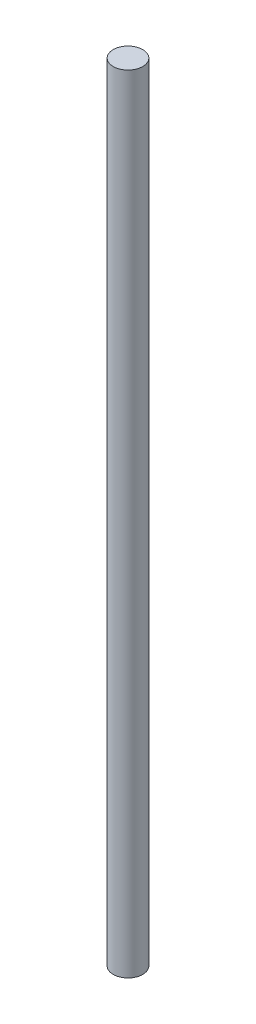
ISO-10303-21;
HEADER;
FILE_DESCRIPTION(('STEP AP214'),'2;1');
FILE_NAME('part.step','',(''),(''),'','','');
FILE_SCHEMA(('AUTOMOTIVE_DESIGN { 1 0 10303 214 1 1 1 1 }'));
ENDSEC;
DATA;
#1=APPLICATION_CONTEXT('core data for automotive mechanical design processes');
#2=APPLICATION_PROTOCOL_DEFINITION('international standard','automotive_design',2000,#1);
#3=PRODUCT_CONTEXT('',#1,'mechanical');
#4=PRODUCT('Part','Part','',(#3));
#5=PRODUCT_RELATED_PRODUCT_CATEGORY('part','',(#4));
#6=PRODUCT_DEFINITION_FORMATION('','',#4);
#7=PRODUCT_DEFINITION_CONTEXT('part definition',#1,'design');
#8=PRODUCT_DEFINITION('design','',#6,#7);
#9=PRODUCT_DEFINITION_SHAPE('','',#8);
#10=(LENGTH_UNIT() NAMED_UNIT(*) SI_UNIT(.MILLI.,.METRE.));
#11=(NAMED_UNIT(*) PLANE_ANGLE_UNIT() SI_UNIT($,.RADIAN.));
#12=(NAMED_UNIT(*) SI_UNIT($,.STERADIAN.) SOLID_ANGLE_UNIT());
#13=UNCERTAINTY_MEASURE_WITH_UNIT(LENGTH_MEASURE(1.E-05),#10,'distance_accuracy_value','');
#14=(GEOMETRIC_REPRESENTATION_CONTEXT(3) GLOBAL_UNCERTAINTY_ASSIGNED_CONTEXT((#13)) GLOBAL_UNIT_ASSIGNED_CONTEXT((#10,
#11,#12)) REPRESENTATION_CONTEXT('',''));
#15=CARTESIAN_POINT('',(0.,0.,0.));
#16=DIRECTION('',(0.,0.,1.));
#17=DIRECTION('',(1.,0.,0.));
#18=AXIS2_PLACEMENT_3D('',#15,#16,#17);
#19=CARTESIAN_POINT('',(0.,2000.,0.));
#20=DIRECTION('',(0.,-1.,0.));
#21=DIRECTION('',(0.,0.,-1.));
#22=AXIS2_PLACEMENT_3D('',#19,#20,#21);
#23=CYLINDRICAL_SURFACE('',#22,37.5);
#24=CARTESIAN_POINT('',(0.,2000.,0.));
#25=DIRECTION('',(0.,1.,0.));
#26=DIRECTION('',(0.,0.,1.));
#27=AXIS2_PLACEMENT_3D('',#24,#25,#26);
#28=CIRCLE('',#27,37.5);
#29=CARTESIAN_POINT('',(0.,2000.,37.5));
#30=VERTEX_POINT('',#29);
#31=EDGE_CURVE('E10',#30,#30,#28,.T.);
#32=ORIENTED_EDGE('',*,*,#31,.F.);
#33=EDGE_LOOP('',(#32));
#34=FACE_BOUND('',#33,.T.);
#35=CARTESIAN_POINT('',(0.,0.,0.));
#36=DIRECTION('',(0.,1.,0.));
#37=DIRECTION('',(0.,0.,1.));
#38=AXIS2_PLACEMENT_3D('',#35,#36,#37);
#39=CIRCLE('',#38,37.5);
#40=CARTESIAN_POINT('',(0.,0.,37.5));
#41=VERTEX_POINT('',#40);
#42=EDGE_CURVE('E34',#41,#41,#39,.T.);
#43=ORIENTED_EDGE('',*,*,#42,.T.);
#44=EDGE_LOOP('',(#43));
#45=FACE_BOUND('',#44,.T.);
#46=ADVANCED_FACE('F31',(#34,#45),#23,.T.);
#47=CARTESIAN_POINT('',(0.,2000.,0.));
#48=DIRECTION('',(0.,1.,0.));
#49=DIRECTION('',(0.,0.,1.));
#50=AXIS2_PLACEMENT_3D('',#47,#48,#49);
#51=PLANE('',#50);
#52=ORIENTED_EDGE('',*,*,#31,.T.);
#53=EDGE_LOOP('',(#52));
#54=FACE_BOUND('',#53,.T.);
#55=ADVANCED_FACE('F46',(#54),#51,.T.);
#56=CARTESIAN_POINT('',(0.,0.,0.));
#57=DIRECTION('',(0.,1.,0.));
#58=DIRECTION('',(0.,0.,1.));
#59=AXIS2_PLACEMENT_3D('',#56,#57,#58);
#60=PLANE('',#59);
#61=ORIENTED_EDGE('',*,*,#42,.F.);
#62=EDGE_LOOP('',(#61));
#63=FACE_BOUND('',#62,.T.);
#64=ADVANCED_FACE('F44',(#63),#60,.F.);
#65=CLOSED_SHELL('',(#46,#55,#64));
#66=MANIFOLD_SOLID_BREP('B2',#65);
#67=ADVANCED_BREP_SHAPE_REPRESENTATION('',(#18,#66),#14);
#68=SHAPE_DEFINITION_REPRESENTATION(#9,#67);
ENDSEC;
END-ISO-10303-21;
